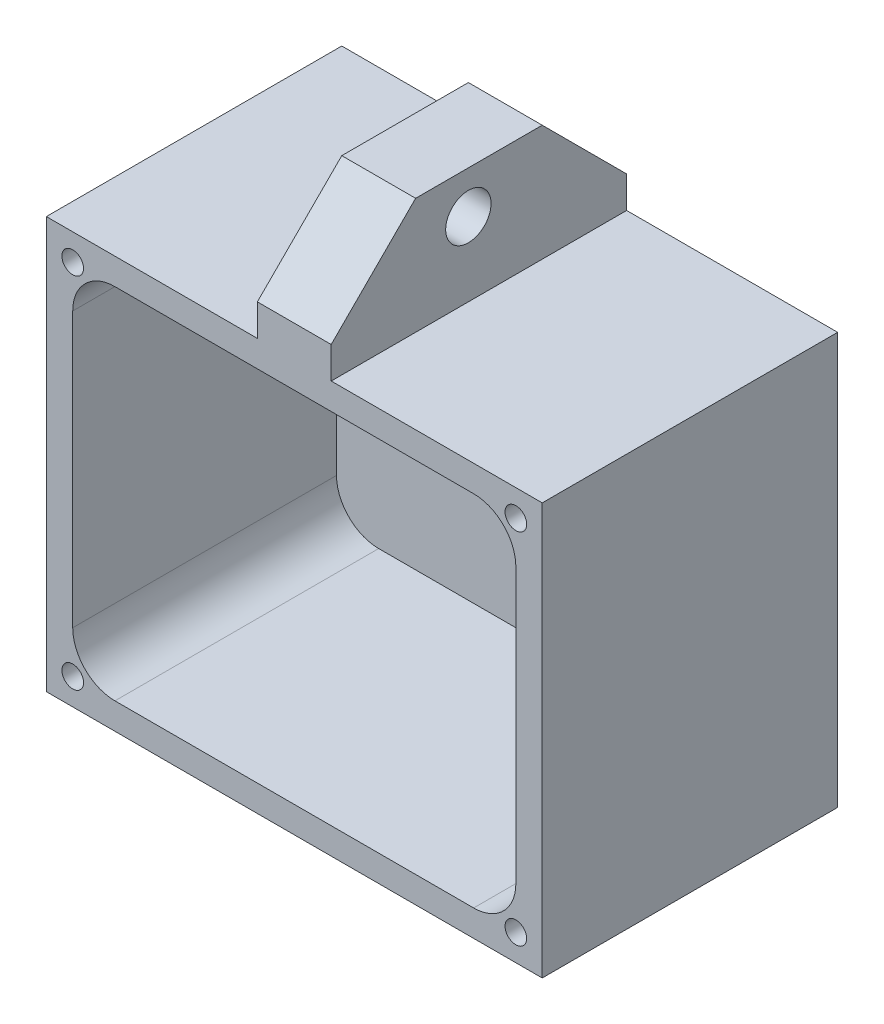
ISO-10303-21;
HEADER;
FILE_DESCRIPTION(('STEP AP214'),'2;1');
FILE_NAME('part.step','',(''),(''),'','','');
FILE_SCHEMA(('AUTOMOTIVE_DESIGN { 1 0 10303 214 1 1 1 1 }'));
ENDSEC;
DATA;
#1=APPLICATION_CONTEXT('core data for automotive mechanical design processes');
#2=APPLICATION_PROTOCOL_DEFINITION('international standard','automotive_design',2000,#1);
#3=PRODUCT_CONTEXT('',#1,'mechanical');
#4=PRODUCT('Part','Part','',(#3));
#5=PRODUCT_RELATED_PRODUCT_CATEGORY('part','',(#4));
#6=PRODUCT_DEFINITION_FORMATION('','',#4);
#7=PRODUCT_DEFINITION_CONTEXT('part definition',#1,'design');
#8=PRODUCT_DEFINITION('design','',#6,#7);
#9=PRODUCT_DEFINITION_SHAPE('','',#8);
#10=(LENGTH_UNIT() NAMED_UNIT(*) SI_UNIT(.MILLI.,.METRE.));
#11=(NAMED_UNIT(*) PLANE_ANGLE_UNIT() SI_UNIT($,.RADIAN.));
#12=(NAMED_UNIT(*) SI_UNIT($,.STERADIAN.) SOLID_ANGLE_UNIT());
#13=UNCERTAINTY_MEASURE_WITH_UNIT(LENGTH_MEASURE(1.E-05),#10,'distance_accuracy_value','');
#14=(GEOMETRIC_REPRESENTATION_CONTEXT(3) GLOBAL_UNCERTAINTY_ASSIGNED_CONTEXT((#13)) GLOBAL_UNIT_ASSIGNED_CONTEXT((#10,
#11,#12)) REPRESENTATION_CONTEXT('',''));
#15=CARTESIAN_POINT('',(0.,0.,0.));
#16=DIRECTION('',(0.,0.,1.));
#17=DIRECTION('',(1.,0.,0.));
#18=AXIS2_PLACEMENT_3D('',#15,#16,#17);
#19=CARTESIAN_POINT('',(-23.5,19.5,28.));
#20=DIRECTION('',(0.,-1.,0.));
#21=DIRECTION('',(0.,0.,-1.));
#22=AXIS2_PLACEMENT_3D('',#19,#20,#21);
#23=PLANE('',#22);
#24=DIRECTION('',(0.,0.,-1.));
#25=VECTOR('',#24,1.);
#26=CARTESIAN_POINT('',(3.5,19.5,41.0384048104053));
#27=LINE('',#26,#25);
#28=CARTESIAN_POINT('',(3.5,19.5,28.));
#29=VERTEX_POINT('',#28);
#30=CARTESIAN_POINT('',(3.5,19.5,0.));
#31=VERTEX_POINT('',#30);
#32=EDGE_CURVE('E253',#29,#31,#27,.T.);
#33=ORIENTED_EDGE('',*,*,#32,.F.);
#34=DIRECTION('',(-1.,0.,0.));
#35=VECTOR('',#34,1.);
#36=CARTESIAN_POINT('',(-23.5,19.5,28.));
#37=LINE('',#36,#35);
#38=CARTESIAN_POINT('',(23.5,19.5,28.));
#39=VERTEX_POINT('',#38);
#40=EDGE_CURVE('E397',#39,#29,#37,.T.);
#41=ORIENTED_EDGE('',*,*,#40,.F.);
#42=DIRECTION('',(0.,0.,-1.));
#43=VECTOR('',#42,1.);
#44=CARTESIAN_POINT('',(23.5,19.5,28.));
#45=LINE('',#44,#43);
#46=CARTESIAN_POINT('',(23.5,19.5,0.));
#47=VERTEX_POINT('',#46);
#48=EDGE_CURVE('E256',#39,#47,#45,.T.);
#49=ORIENTED_EDGE('',*,*,#48,.T.);
#50=DIRECTION('',(-1.,0.,0.));
#51=VECTOR('',#50,1.);
#52=CARTESIAN_POINT('',(-23.5,19.5,0.));
#53=LINE('',#52,#51);
#54=EDGE_CURVE('E242',#47,#31,#53,.T.);
#55=ORIENTED_EDGE('',*,*,#54,.T.);
#56=EDGE_LOOP('',(#33,#41,#49,#55));
#57=FACE_BOUND('',#56,.T.);
#58=ADVANCED_FACE('F59',(#57),#23,.F.);
#59=CARTESIAN_POINT('',(23.5,-19.5,28.));
#60=DIRECTION('',(-1.,0.,0.));
#61=DIRECTION('',(0.,0.,1.));
#62=AXIS2_PLACEMENT_3D('',#59,#60,#61);
#63=PLANE('',#62);
#64=DIRECTION('',(0.,1.,0.));
#65=VECTOR('',#64,1.);
#66=CARTESIAN_POINT('',(23.5,-19.5,0.));
#67=LINE('',#66,#65);
#68=CARTESIAN_POINT('',(23.5,-19.5,0.));
#69=VERTEX_POINT('',#68);
#70=EDGE_CURVE('E380',#69,#47,#67,.T.);
#71=ORIENTED_EDGE('',*,*,#70,.T.);
#72=ORIENTED_EDGE('',*,*,#48,.F.);
#73=DIRECTION('',(0.,1.,0.));
#74=VECTOR('',#73,1.);
#75=CARTESIAN_POINT('',(23.5,-19.5,28.));
#76=LINE('',#75,#74);
#77=CARTESIAN_POINT('',(23.5,-19.5,28.));
#78=VERTEX_POINT('',#77);
#79=EDGE_CURVE('E388',#78,#39,#76,.T.);
#80=ORIENTED_EDGE('',*,*,#79,.F.);
#81=DIRECTION('',(0.,0.,-1.));
#82=VECTOR('',#81,1.);
#83=CARTESIAN_POINT('',(23.5,-19.5,28.));
#84=LINE('',#83,#82);
#85=EDGE_CURVE('E410',#78,#69,#84,.T.);
#86=ORIENTED_EDGE('',*,*,#85,.T.);
#87=EDGE_LOOP('',(#71,#72,#80,#86));
#88=FACE_BOUND('',#87,.T.);
#89=ADVANCED_FACE('F531',(#88),#63,.F.);
#90=CARTESIAN_POINT('',(-3.5,19.5,28.));
#91=VERTEX_POINT('',#90);
#92=CARTESIAN_POINT('',(-23.5,19.5,28.));
#93=VERTEX_POINT('',#92);
#94=EDGE_CURVE('E279',#91,#93,#37,.T.);
#95=ORIENTED_EDGE('',*,*,#94,.F.);
#96=DIRECTION('',(0.,0.,-1.));
#97=VECTOR('',#96,1.);
#98=CARTESIAN_POINT('',(-3.5,19.5,41.0384048104053));
#99=LINE('',#98,#97);
#100=CARTESIAN_POINT('',(-3.5,19.5,0.));
#101=VERTEX_POINT('',#100);
#102=EDGE_CURVE('E267',#91,#101,#99,.T.);
#103=ORIENTED_EDGE('',*,*,#102,.T.);
#104=CARTESIAN_POINT('',(-23.5,19.5,0.));
#105=VERTEX_POINT('',#104);
#106=EDGE_CURVE('E260',#101,#105,#53,.T.);
#107=ORIENTED_EDGE('',*,*,#106,.T.);
#108=DIRECTION('',(0.,0.,-1.));
#109=VECTOR('',#108,1.);
#110=CARTESIAN_POINT('',(-23.5,19.5,28.));
#111=LINE('',#110,#109);
#112=EDGE_CURVE('E419',#93,#105,#111,.T.);
#113=ORIENTED_EDGE('',*,*,#112,.F.);
#114=EDGE_LOOP('',(#95,#103,#107,#113));
#115=FACE_BOUND('',#114,.T.);
#116=ADVANCED_FACE('F533',(#115),#23,.F.);
#117=CARTESIAN_POINT('',(-23.5,-19.5,28.));
#118=DIRECTION('',(1.,0.,0.));
#119=DIRECTION('',(0.,0.,-1.));
#120=AXIS2_PLACEMENT_3D('',#117,#118,#119);
#121=PLANE('',#120);
#122=DIRECTION('',(0.,-1.,0.));
#123=VECTOR('',#122,1.);
#124=CARTESIAN_POINT('',(-23.5,-19.5,0.));
#125=LINE('',#124,#123);
#126=CARTESIAN_POINT('',(-23.5,-19.5,0.));
#127=VERTEX_POINT('',#126);
#128=EDGE_CURVE('E259',#105,#127,#125,.T.);
#129=ORIENTED_EDGE('',*,*,#128,.T.);
#130=DIRECTION('',(0.,0.,-1.));
#131=VECTOR('',#130,1.);
#132=CARTESIAN_POINT('',(-23.5,-19.5,28.));
#133=LINE('',#132,#131);
#134=CARTESIAN_POINT('',(-23.5,-19.5,28.));
#135=VERTEX_POINT('',#134);
#136=EDGE_CURVE('E414',#135,#127,#133,.T.);
#137=ORIENTED_EDGE('',*,*,#136,.F.);
#138=DIRECTION('',(0.,-1.,0.));
#139=VECTOR('',#138,1.);
#140=CARTESIAN_POINT('',(-23.5,-19.5,28.));
#141=LINE('',#140,#139);
#142=EDGE_CURVE('E394',#93,#135,#141,.T.);
#143=ORIENTED_EDGE('',*,*,#142,.F.);
#144=ORIENTED_EDGE('',*,*,#112,.T.);
#145=EDGE_LOOP('',(#129,#137,#143,#144));
#146=FACE_BOUND('',#145,.T.);
#147=ADVANCED_FACE('F541',(#146),#121,.F.);
#148=CARTESIAN_POINT('',(-23.5,-19.5,28.));
#149=DIRECTION('',(0.,1.,0.));
#150=DIRECTION('',(0.,0.,1.));
#151=AXIS2_PLACEMENT_3D('',#148,#149,#150);
#152=PLANE('',#151);
#153=DIRECTION('',(1.,0.,0.));
#154=VECTOR('',#153,1.);
#155=CARTESIAN_POINT('',(-23.5,-19.5,0.));
#156=LINE('',#155,#154);
#157=EDGE_CURVE('E391',#127,#69,#156,.T.);
#158=ORIENTED_EDGE('',*,*,#157,.T.);
#159=ORIENTED_EDGE('',*,*,#85,.F.);
#160=DIRECTION('',(1.,0.,0.));
#161=VECTOR('',#160,1.);
#162=CARTESIAN_POINT('',(-23.5,-19.5,28.));
#163=LINE('',#162,#161);
#164=EDGE_CURVE('E415',#135,#78,#163,.T.);
#165=ORIENTED_EDGE('',*,*,#164,.F.);
#166=ORIENTED_EDGE('',*,*,#136,.T.);
#167=EDGE_LOOP('',(#158,#159,#165,#166));
#168=FACE_BOUND('',#167,.T.);
#169=ADVANCED_FACE('F546',(#168),#152,.F.);
#170=CARTESIAN_POINT('',(0.,0.,28.));
#171=DIRECTION('',(0.,0.,-1.));
#172=DIRECTION('',(-1.,0.,0.));
#173=AXIS2_PLACEMENT_3D('',#170,#171,#172);
#174=PLANE('',#173);
#175=CARTESIAN_POINT('',(21.,17.,28.));
#176=DIRECTION('',(0.,0.,1.));
#177=DIRECTION('',(1.,0.,0.));
#178=AXIS2_PLACEMENT_3D('',#175,#176,#177);
#179=CIRCLE('',#178,1.02499999999999);
#180=CARTESIAN_POINT('',(22.025,17.,28.));
#181=VERTEX_POINT('',#180);
#182=EDGE_CURVE('E323',#181,#181,#179,.T.);
#183=ORIENTED_EDGE('',*,*,#182,.F.);
#184=EDGE_LOOP('',(#183));
#185=FACE_BOUND('',#184,.T.);
#186=CARTESIAN_POINT('',(-21.,-17.,28.));
#187=DIRECTION('',(0.,0.,1.));
#188=DIRECTION('',(1.,0.,0.));
#189=AXIS2_PLACEMENT_3D('',#186,#187,#188);
#190=CIRCLE('',#189,1.02499999999999);
#191=CARTESIAN_POINT('',(-19.975,-17.,28.));
#192=VERTEX_POINT('',#191);
#193=EDGE_CURVE('E331',#192,#192,#190,.T.);
#194=ORIENTED_EDGE('',*,*,#193,.F.);
#195=EDGE_LOOP('',(#194));
#196=FACE_BOUND('',#195,.T.);
#197=CARTESIAN_POINT('',(-21.,17.,28.));
#198=DIRECTION('',(0.,0.,1.));
#199=DIRECTION('',(1.,0.,0.));
#200=AXIS2_PLACEMENT_3D('',#197,#198,#199);
#201=CIRCLE('',#200,1.02499999999999);
#202=CARTESIAN_POINT('',(-19.975,17.,28.));
#203=VERTEX_POINT('',#202);
#204=EDGE_CURVE('E339',#203,#203,#201,.T.);
#205=ORIENTED_EDGE('',*,*,#204,.F.);
#206=EDGE_LOOP('',(#205));
#207=FACE_BOUND('',#206,.T.);
#208=CARTESIAN_POINT('',(21.,-17.,28.));
#209=DIRECTION('',(0.,0.,1.));
#210=DIRECTION('',(1.,0.,0.));
#211=AXIS2_PLACEMENT_3D('',#208,#209,#210);
#212=CIRCLE('',#211,1.02499999999999);
#213=CARTESIAN_POINT('',(22.025,-17.,28.));
#214=VERTEX_POINT('',#213);
#215=EDGE_CURVE('E347',#214,#214,#212,.T.);
#216=ORIENTED_EDGE('',*,*,#215,.F.);
#217=EDGE_LOOP('',(#216));
#218=FACE_BOUND('',#217,.T.);
#219=DIRECTION('',(0.,-1.,0.));
#220=VECTOR('',#219,1.);
#221=CARTESIAN_POINT('',(-21.,17.,28.));
#222=LINE('',#221,#220);
#223=CARTESIAN_POINT('',(-21.,13.,28.));
#224=VERTEX_POINT('',#223);
#225=CARTESIAN_POINT('',(-21.,-13.,28.));
#226=VERTEX_POINT('',#225);
#227=EDGE_CURVE('E361',#224,#226,#222,.T.);
#228=ORIENTED_EDGE('',*,*,#227,.F.);
#229=CARTESIAN_POINT('',(-17.,13.,28.));
#230=DIRECTION('',(0.,0.,-1.));
#231=DIRECTION('',(-1.,0.,0.));
#232=AXIS2_PLACEMENT_3D('',#229,#230,#231);
#233=CIRCLE('',#232,4.);
#234=CARTESIAN_POINT('',(-17.,17.,28.));
#235=VERTEX_POINT('',#234);
#236=EDGE_CURVE('E471',#224,#235,#233,.T.);
#237=ORIENTED_EDGE('',*,*,#236,.T.);
#238=DIRECTION('',(-1.,0.,0.));
#239=VECTOR('',#238,1.);
#240=CARTESIAN_POINT('',(-21.,17.,28.));
#241=LINE('',#240,#239);
#242=CARTESIAN_POINT('',(17.,17.,28.));
#243=VERTEX_POINT('',#242);
#244=EDGE_CURVE('E365',#243,#235,#241,.T.);
#245=ORIENTED_EDGE('',*,*,#244,.F.);
#246=CARTESIAN_POINT('',(17.,13.,28.));
#247=DIRECTION('',(0.,0.,-1.));
#248=DIRECTION('',(-1.,0.,0.));
#249=AXIS2_PLACEMENT_3D('',#246,#247,#248);
#250=CIRCLE('',#249,4.);
#251=CARTESIAN_POINT('',(21.,13.,28.));
#252=VERTEX_POINT('',#251);
#253=EDGE_CURVE('E473',#243,#252,#250,.T.);
#254=ORIENTED_EDGE('',*,*,#253,.T.);
#255=DIRECTION('',(0.,1.,0.));
#256=VECTOR('',#255,1.);
#257=CARTESIAN_POINT('',(21.,17.,28.));
#258=LINE('',#257,#256);
#259=CARTESIAN_POINT('',(21.,-13.,28.));
#260=VERTEX_POINT('',#259);
#261=EDGE_CURVE('E355',#260,#252,#258,.T.);
#262=ORIENTED_EDGE('',*,*,#261,.F.);
#263=CARTESIAN_POINT('',(17.,-13.,28.));
#264=DIRECTION('',(0.,0.,-1.));
#265=DIRECTION('',(-1.,0.,0.));
#266=AXIS2_PLACEMENT_3D('',#263,#264,#265);
#267=CIRCLE('',#266,4.);
#268=CARTESIAN_POINT('',(17.,-17.,28.));
#269=VERTEX_POINT('',#268);
#270=EDGE_CURVE('E465',#260,#269,#267,.T.);
#271=ORIENTED_EDGE('',*,*,#270,.T.);
#272=DIRECTION('',(1.,0.,0.));
#273=VECTOR('',#272,1.);
#274=CARTESIAN_POINT('',(-21.,-17.,28.));
#275=LINE('',#274,#273);
#276=CARTESIAN_POINT('',(-17.,-17.,28.));
#277=VERTEX_POINT('',#276);
#278=EDGE_CURVE('E356',#277,#269,#275,.T.);
#279=ORIENTED_EDGE('',*,*,#278,.F.);
#280=CARTESIAN_POINT('',(-17.,-13.,28.));
#281=DIRECTION('',(0.,0.,-1.));
#282=DIRECTION('',(-1.,0.,0.));
#283=AXIS2_PLACEMENT_3D('',#280,#281,#282);
#284=CIRCLE('',#283,4.);
#285=EDGE_CURVE('E468',#277,#226,#284,.T.);
#286=ORIENTED_EDGE('',*,*,#285,.T.);
#287=EDGE_LOOP('',(#228,#237,#245,#254,#262,#271,#279,#286));
#288=FACE_BOUND('',#287,.T.);
#289=DIRECTION('',(0.,1.,0.));
#290=VECTOR('',#289,1.);
#291=CARTESIAN_POINT('',(3.5,30.5,28.));
#292=LINE('',#291,#290);
#293=CARTESIAN_POINT('',(3.5,22.5,28.));
#294=VERTEX_POINT('',#293);
#295=EDGE_CURVE('E265',#29,#294,#292,.T.);
#296=ORIENTED_EDGE('',*,*,#295,.T.);
#297=DIRECTION('',(-1.,0.,0.));
#298=VECTOR('',#297,1.);
#299=CARTESIAN_POINT('',(-3.5,22.5,28.));
#300=LINE('',#299,#298);
#301=CARTESIAN_POINT('',(-3.5,22.5,28.));
#302=VERTEX_POINT('',#301);
#303=EDGE_CURVE('E14',#294,#302,#300,.T.);
#304=ORIENTED_EDGE('',*,*,#303,.T.);
#305=DIRECTION('',(0.,-1.,0.));
#306=VECTOR('',#305,1.);
#307=CARTESIAN_POINT('',(-3.5,30.5,28.));
#308=LINE('',#307,#306);
#309=EDGE_CURVE('E299',#302,#91,#308,.T.);
#310=ORIENTED_EDGE('',*,*,#309,.T.);
#311=ORIENTED_EDGE('',*,*,#94,.T.);
#312=ORIENTED_EDGE('',*,*,#142,.T.);
#313=ORIENTED_EDGE('',*,*,#164,.T.);
#314=ORIENTED_EDGE('',*,*,#79,.T.);
#315=ORIENTED_EDGE('',*,*,#40,.T.);
#316=EDGE_LOOP('',(#296,#304,#310,#311,#312,#313,#314,#315));
#317=FACE_BOUND('',#316,.T.);
#318=ADVANCED_FACE('F563',(#185,#196,#207,#218,#288,#317),#174,.F.);
#319=CARTESIAN_POINT('',(0.,0.,0.));
#320=DIRECTION('',(0.,0.,-1.));
#321=DIRECTION('',(-1.,0.,0.));
#322=AXIS2_PLACEMENT_3D('',#319,#320,#321);
#323=PLANE('',#322);
#324=CARTESIAN_POINT('',(0.,0.,0.));
#325=DIRECTION('',(0.,0.,-1.));
#326=DIRECTION('',(-1.,0.,0.));
#327=AXIS2_PLACEMENT_3D('',#324,#325,#326);
#328=CIRCLE('',#327,6.);
#329=CARTESIAN_POINT('',(-6.,0.,0.));
#330=VERTEX_POINT('',#329);
#331=EDGE_CURVE('E295',#330,#330,#328,.F.);
#332=ORIENTED_EDGE('',*,*,#331,.T.);
#333=EDGE_LOOP('',(#332));
#334=FACE_BOUND('',#333,.T.);
#335=CARTESIAN_POINT('',(12.,-6.5,0.));
#336=DIRECTION('',(0.,0.,-1.));
#337=DIRECTION('',(-1.,0.,0.));
#338=AXIS2_PLACEMENT_3D('',#335,#336,#337);
#339=CIRCLE('',#338,1.24999999999999);
#340=CARTESIAN_POINT('',(10.75,-6.5,0.));
#341=VERTEX_POINT('',#340);
#342=EDGE_CURVE('E294',#341,#341,#339,.T.);
#343=ORIENTED_EDGE('',*,*,#342,.F.);
#344=EDGE_LOOP('',(#343));
#345=FACE_BOUND('',#344,.T.);
#346=CARTESIAN_POINT('',(-12.,-6.5,0.));
#347=DIRECTION('',(0.,0.,-1.));
#348=DIRECTION('',(-1.,0.,0.));
#349=AXIS2_PLACEMENT_3D('',#346,#347,#348);
#350=CIRCLE('',#349,1.24999999999999);
#351=CARTESIAN_POINT('',(-13.25,-6.5,0.));
#352=VERTEX_POINT('',#351);
#353=EDGE_CURVE('E307',#352,#352,#350,.T.);
#354=ORIENTED_EDGE('',*,*,#353,.F.);
#355=EDGE_LOOP('',(#354));
#356=FACE_BOUND('',#355,.T.);
#357=CARTESIAN_POINT('',(0.,10.5,0.));
#358=DIRECTION('',(0.,0.,-1.));
#359=DIRECTION('',(-1.,0.,0.));
#360=AXIS2_PLACEMENT_3D('',#357,#358,#359);
#361=CIRCLE('',#360,1.24999999999999);
#362=CARTESIAN_POINT('',(-1.24999999999999,10.5,0.));
#363=VERTEX_POINT('',#362);
#364=EDGE_CURVE('E315',#363,#363,#361,.T.);
#365=ORIENTED_EDGE('',*,*,#364,.F.);
#366=EDGE_LOOP('',(#365));
#367=FACE_BOUND('',#366,.T.);
#368=DIRECTION('',(0.,1.,0.));
#369=VECTOR('',#368,1.);
#370=CARTESIAN_POINT('',(-3.5,30.5,0.));
#371=LINE('',#370,#369);
#372=CARTESIAN_POINT('',(-3.5,22.5,0.));
#373=VERTEX_POINT('',#372);
#374=EDGE_CURVE('E250',#101,#373,#371,.T.);
#375=ORIENTED_EDGE('',*,*,#374,.T.);
#376=DIRECTION('',(1.,0.,0.));
#377=VECTOR('',#376,1.);
#378=CARTESIAN_POINT('',(0.,22.5,0.));
#379=LINE('',#378,#377);
#380=CARTESIAN_POINT('',(3.5,22.5,0.));
#381=VERTEX_POINT('',#380);
#382=EDGE_CURVE('E245',#373,#381,#379,.T.);
#383=ORIENTED_EDGE('',*,*,#382,.T.);
#384=DIRECTION('',(0.,-1.,0.));
#385=VECTOR('',#384,1.);
#386=CARTESIAN_POINT('',(3.5,30.5,0.));
#387=LINE('',#386,#385);
#388=EDGE_CURVE('E237',#381,#31,#387,.T.);
#389=ORIENTED_EDGE('',*,*,#388,.T.);
#390=ORIENTED_EDGE('',*,*,#54,.F.);
#391=ORIENTED_EDGE('',*,*,#70,.F.);
#392=ORIENTED_EDGE('',*,*,#157,.F.);
#393=ORIENTED_EDGE('',*,*,#128,.F.);
#394=ORIENTED_EDGE('',*,*,#106,.F.);
#395=EDGE_LOOP('',(#375,#383,#389,#390,#391,#392,#393,#394));
#396=FACE_BOUND('',#395,.T.);
#397=ADVANCED_FACE('F240',(#334,#345,#356,#367,#396),#323,.T.);
#398=CARTESIAN_POINT('',(0.,0.,3.));
#399=DIRECTION('',(0.,0.,-1.));
#400=DIRECTION('',(-1.,0.,0.));
#401=AXIS2_PLACEMENT_3D('',#398,#399,#400);
#402=PLANE('',#401);
#403=CARTESIAN_POINT('',(0.,0.,3.));
#404=DIRECTION('',(0.,0.,1.));
#405=DIRECTION('',(1.,0.,0.));
#406=AXIS2_PLACEMENT_3D('',#403,#404,#405);
#407=CIRCLE('',#406,6.);
#408=CARTESIAN_POINT('',(6.,0.,3.));
#409=VERTEX_POINT('',#408);
#410=EDGE_CURVE('E290',#409,#409,#407,.T.);
#411=ORIENTED_EDGE('',*,*,#410,.F.);
#412=EDGE_LOOP('',(#411));
#413=FACE_BOUND('',#412,.T.);
#414=CARTESIAN_POINT('',(12.,-6.5,3.));
#415=DIRECTION('',(0.,0.,-1.));
#416=DIRECTION('',(-1.,0.,0.));
#417=AXIS2_PLACEMENT_3D('',#414,#415,#416);
#418=CIRCLE('',#417,1.24999999999999);
#419=CARTESIAN_POINT('',(10.75,-6.5,3.));
#420=VERTEX_POINT('',#419);
#421=EDGE_CURVE('E303',#420,#420,#418,.T.);
#422=ORIENTED_EDGE('',*,*,#421,.T.);
#423=EDGE_LOOP('',(#422));
#424=FACE_BOUND('',#423,.T.);
#425=CARTESIAN_POINT('',(-12.,-6.5,3.));
#426=DIRECTION('',(0.,0.,-1.));
#427=DIRECTION('',(-1.,0.,0.));
#428=AXIS2_PLACEMENT_3D('',#425,#426,#427);
#429=CIRCLE('',#428,1.24999999999999);
#430=CARTESIAN_POINT('',(-13.25,-6.5,3.));
#431=VERTEX_POINT('',#430);
#432=EDGE_CURVE('E311',#431,#431,#429,.T.);
#433=ORIENTED_EDGE('',*,*,#432,.T.);
#434=EDGE_LOOP('',(#433));
#435=FACE_BOUND('',#434,.T.);
#436=CARTESIAN_POINT('',(0.,10.5,3.));
#437=DIRECTION('',(0.,0.,-1.));
#438=DIRECTION('',(-1.,0.,0.));
#439=AXIS2_PLACEMENT_3D('',#436,#437,#438);
#440=CIRCLE('',#439,1.24999999999999);
#441=CARTESIAN_POINT('',(-1.24999999999999,10.5,3.));
#442=VERTEX_POINT('',#441);
#443=EDGE_CURVE('E319',#442,#442,#440,.T.);
#444=ORIENTED_EDGE('',*,*,#443,.T.);
#445=EDGE_LOOP('',(#444));
#446=FACE_BOUND('',#445,.T.);
#447=DIRECTION('',(1.,0.,0.));
#448=VECTOR('',#447,1.);
#449=CARTESIAN_POINT('',(-21.,-17.,3.));
#450=LINE('',#449,#448);
#451=CARTESIAN_POINT('',(-17.,-17.,3.));
#452=VERTEX_POINT('',#451);
#453=CARTESIAN_POINT('',(17.,-17.,3.));
#454=VERTEX_POINT('',#453);
#455=EDGE_CURVE('E381',#452,#454,#450,.T.);
#456=ORIENTED_EDGE('',*,*,#455,.T.);
#457=CARTESIAN_POINT('',(17.,-13.,3.));
#458=DIRECTION('',(0.,0.,-1.));
#459=DIRECTION('',(-1.,0.,0.));
#460=AXIS2_PLACEMENT_3D('',#457,#458,#459);
#461=CIRCLE('',#460,4.);
#462=CARTESIAN_POINT('',(21.,-13.,3.));
#463=VERTEX_POINT('',#462);
#464=EDGE_CURVE('E448',#454,#463,#461,.F.);
#465=ORIENTED_EDGE('',*,*,#464,.T.);
#466=DIRECTION('',(0.,1.,0.));
#467=VECTOR('',#466,1.);
#468=CARTESIAN_POINT('',(21.,17.,3.));
#469=LINE('',#468,#467);
#470=CARTESIAN_POINT('',(21.,13.,3.));
#471=VERTEX_POINT('',#470);
#472=EDGE_CURVE('E376',#463,#471,#469,.T.);
#473=ORIENTED_EDGE('',*,*,#472,.T.);
#474=CARTESIAN_POINT('',(17.,13.,3.));
#475=DIRECTION('',(0.,0.,-1.));
#476=DIRECTION('',(-1.,0.,0.));
#477=AXIS2_PLACEMENT_3D('',#474,#475,#476);
#478=CIRCLE('',#477,4.);
#479=CARTESIAN_POINT('',(17.,17.,3.));
#480=VERTEX_POINT('',#479);
#481=EDGE_CURVE('E439',#471,#480,#478,.F.);
#482=ORIENTED_EDGE('',*,*,#481,.T.);
#483=DIRECTION('',(-1.,0.,0.));
#484=VECTOR('',#483,1.);
#485=CARTESIAN_POINT('',(-21.,17.,3.));
#486=LINE('',#485,#484);
#487=CARTESIAN_POINT('',(-17.,17.,3.));
#488=VERTEX_POINT('',#487);
#489=EDGE_CURVE('E360',#480,#488,#486,.T.);
#490=ORIENTED_EDGE('',*,*,#489,.T.);
#491=CARTESIAN_POINT('',(-17.,13.,3.));
#492=DIRECTION('',(0.,0.,-1.));
#493=DIRECTION('',(-1.,0.,0.));
#494=AXIS2_PLACEMENT_3D('',#491,#492,#493);
#495=CIRCLE('',#494,4.);
#496=CARTESIAN_POINT('',(-21.,13.,3.));
#497=VERTEX_POINT('',#496);
#498=EDGE_CURVE('E442',#488,#497,#495,.F.);
#499=ORIENTED_EDGE('',*,*,#498,.T.);
#500=DIRECTION('',(0.,-1.,0.));
#501=VECTOR('',#500,1.);
#502=CARTESIAN_POINT('',(-21.,17.,3.));
#503=LINE('',#502,#501);
#504=CARTESIAN_POINT('',(-21.,-13.,3.));
#505=VERTEX_POINT('',#504);
#506=EDGE_CURVE('E375',#497,#505,#503,.T.);
#507=ORIENTED_EDGE('',*,*,#506,.T.);
#508=CARTESIAN_POINT('',(-17.,-13.,3.));
#509=DIRECTION('',(0.,0.,-1.));
#510=DIRECTION('',(-1.,0.,0.));
#511=AXIS2_PLACEMENT_3D('',#508,#509,#510);
#512=CIRCLE('',#511,4.);
#513=EDGE_CURVE('E445',#505,#452,#512,.F.);
#514=ORIENTED_EDGE('',*,*,#513,.T.);
#515=EDGE_LOOP('',(#456,#465,#473,#482,#490,#499,#507,#514));
#516=FACE_BOUND('',#515,.T.);
#517=ADVANCED_FACE('F583',(#413,#424,#435,#446,#516),#402,.F.);
#518=CARTESIAN_POINT('',(-21.,17.,-54.0370243444252));
#519=DIRECTION('',(0.,1.,0.));
#520=DIRECTION('',(0.,0.,1.));
#521=AXIS2_PLACEMENT_3D('',#518,#519,#520);
#522=PLANE('',#521);
#523=ORIENTED_EDGE('',*,*,#244,.T.);
#524=DIRECTION('',(0.,0.,1.));
#525=VECTOR('',#524,1.);
#526=CARTESIAN_POINT('',(-17.,17.,3.));
#527=LINE('',#526,#525);
#528=EDGE_CURVE('E462',#235,#488,#527,.F.);
#529=ORIENTED_EDGE('',*,*,#528,.T.);
#530=ORIENTED_EDGE('',*,*,#489,.F.);
#531=DIRECTION('',(0.,0.,1.));
#532=VECTOR('',#531,1.);
#533=CARTESIAN_POINT('',(17.,17.,28.));
#534=LINE('',#533,#532);
#535=EDGE_CURVE('E458',#480,#243,#534,.T.);
#536=ORIENTED_EDGE('',*,*,#535,.T.);
#537=EDGE_LOOP('',(#523,#529,#530,#536));
#538=FACE_BOUND('',#537,.T.);
#539=ADVANCED_FACE('F588',(#538),#522,.F.);
#540=CARTESIAN_POINT('',(-21.,17.,-54.0370243444252));
#541=DIRECTION('',(-1.,0.,0.));
#542=DIRECTION('',(0.,-1.,0.));
#543=AXIS2_PLACEMENT_3D('',#540,#541,#542);
#544=PLANE('',#543);
#545=ORIENTED_EDGE('',*,*,#227,.T.);
#546=DIRECTION('',(0.,0.,1.));
#547=VECTOR('',#546,1.);
#548=CARTESIAN_POINT('',(-21.,-13.,3.));
#549=LINE('',#548,#547);
#550=EDGE_CURVE('E455',#226,#505,#549,.F.);
#551=ORIENTED_EDGE('',*,*,#550,.T.);
#552=ORIENTED_EDGE('',*,*,#506,.F.);
#553=DIRECTION('',(0.,0.,1.));
#554=VECTOR('',#553,1.);
#555=CARTESIAN_POINT('',(-21.,13.,28.));
#556=LINE('',#555,#554);
#557=EDGE_CURVE('E451',#497,#224,#556,.T.);
#558=ORIENTED_EDGE('',*,*,#557,.T.);
#559=EDGE_LOOP('',(#545,#551,#552,#558));
#560=FACE_BOUND('',#559,.T.);
#561=ADVANCED_FACE('F592',(#560),#544,.F.);
#562=CARTESIAN_POINT('',(-21.,-17.,-54.0370243444252));
#563=DIRECTION('',(0.,-1.,0.));
#564=DIRECTION('',(0.,0.,-1.));
#565=AXIS2_PLACEMENT_3D('',#562,#563,#564);
#566=PLANE('',#565);
#567=ORIENTED_EDGE('',*,*,#278,.T.);
#568=DIRECTION('',(0.,0.,1.));
#569=VECTOR('',#568,1.);
#570=CARTESIAN_POINT('',(17.,-17.,3.));
#571=LINE('',#570,#569);
#572=EDGE_CURVE('E436',#269,#454,#571,.F.);
#573=ORIENTED_EDGE('',*,*,#572,.T.);
#574=ORIENTED_EDGE('',*,*,#455,.F.);
#575=DIRECTION('',(0.,0.,1.));
#576=VECTOR('',#575,1.);
#577=CARTESIAN_POINT('',(-17.,-17.,28.));
#578=LINE('',#577,#576);
#579=EDGE_CURVE('E432',#452,#277,#578,.T.);
#580=ORIENTED_EDGE('',*,*,#579,.T.);
#581=EDGE_LOOP('',(#567,#573,#574,#580));
#582=FACE_BOUND('',#581,.T.);
#583=ADVANCED_FACE('F596',(#582),#566,.F.);
#584=CARTESIAN_POINT('',(21.,17.,-54.0370243444252));
#585=DIRECTION('',(1.,0.,0.));
#586=DIRECTION('',(0.,0.,-1.));
#587=AXIS2_PLACEMENT_3D('',#584,#585,#586);
#588=PLANE('',#587);
#589=ORIENTED_EDGE('',*,*,#472,.F.);
#590=DIRECTION('',(0.,0.,1.));
#591=VECTOR('',#590,1.);
#592=CARTESIAN_POINT('',(21.,-13.,28.));
#593=LINE('',#592,#591);
#594=EDGE_CURVE('E428',#463,#260,#593,.T.);
#595=ORIENTED_EDGE('',*,*,#594,.T.);
#596=ORIENTED_EDGE('',*,*,#261,.T.);
#597=DIRECTION('',(0.,0.,1.));
#598=VECTOR('',#597,1.);
#599=CARTESIAN_POINT('',(21.,13.,3.));
#600=LINE('',#599,#598);
#601=EDGE_CURVE('E425',#252,#471,#600,.F.);
#602=ORIENTED_EDGE('',*,*,#601,.T.);
#603=EDGE_LOOP('',(#589,#595,#596,#602));
#604=FACE_BOUND('',#603,.T.);
#605=ADVANCED_FACE('F600',(#604),#588,.F.);
#606=CARTESIAN_POINT('',(17.,-13.,-54.0370243444252));
#607=DIRECTION('',(0.,0.,-1.));
#608=DIRECTION('',(-1.,0.,0.));
#609=AXIS2_PLACEMENT_3D('',#606,#607,#608);
#610=CYLINDRICAL_SURFACE('',#609,4.);
#611=ORIENTED_EDGE('',*,*,#464,.F.);
#612=ORIENTED_EDGE('',*,*,#572,.F.);
#613=ORIENTED_EDGE('',*,*,#270,.F.);
#614=ORIENTED_EDGE('',*,*,#594,.F.);
#615=EDGE_LOOP('',(#611,#612,#613,#614));
#616=FACE_BOUND('',#615,.T.);
#617=ADVANCED_FACE('F604',(#616),#610,.F.);
#618=CARTESIAN_POINT('',(-17.,-13.,-54.0370243444252));
#619=DIRECTION('',(0.,0.,-1.));
#620=DIRECTION('',(-1.,0.,0.));
#621=AXIS2_PLACEMENT_3D('',#618,#619,#620);
#622=CYLINDRICAL_SURFACE('',#621,4.);
#623=ORIENTED_EDGE('',*,*,#513,.F.);
#624=ORIENTED_EDGE('',*,*,#550,.F.);
#625=ORIENTED_EDGE('',*,*,#285,.F.);
#626=ORIENTED_EDGE('',*,*,#579,.F.);
#627=EDGE_LOOP('',(#623,#624,#625,#626));
#628=FACE_BOUND('',#627,.T.);
#629=ADVANCED_FACE('F677',(#628),#622,.F.);
#630=CARTESIAN_POINT('',(-17.,13.,-54.0370243444252));
#631=DIRECTION('',(0.,0.,-1.));
#632=DIRECTION('',(-1.,0.,0.));
#633=AXIS2_PLACEMENT_3D('',#630,#631,#632);
#634=CYLINDRICAL_SURFACE('',#633,4.);
#635=ORIENTED_EDGE('',*,*,#498,.F.);
#636=ORIENTED_EDGE('',*,*,#528,.F.);
#637=ORIENTED_EDGE('',*,*,#236,.F.);
#638=ORIENTED_EDGE('',*,*,#557,.F.);
#639=EDGE_LOOP('',(#635,#636,#637,#638));
#640=FACE_BOUND('',#639,.T.);
#641=ADVANCED_FACE('F683',(#640),#634,.F.);
#642=CARTESIAN_POINT('',(17.,13.,-54.0370243444252));
#643=DIRECTION('',(0.,0.,-1.));
#644=DIRECTION('',(-1.,0.,0.));
#645=AXIS2_PLACEMENT_3D('',#642,#643,#644);
#646=CYLINDRICAL_SURFACE('',#645,4.);
#647=ORIENTED_EDGE('',*,*,#481,.F.);
#648=ORIENTED_EDGE('',*,*,#601,.F.);
#649=ORIENTED_EDGE('',*,*,#253,.F.);
#650=ORIENTED_EDGE('',*,*,#535,.F.);
#651=EDGE_LOOP('',(#647,#648,#649,#650));
#652=FACE_BOUND('',#651,.T.);
#653=ADVANCED_FACE('F610',(#652),#646,.F.);
#654=CARTESIAN_POINT('',(21.,-17.,21.65));
#655=DIRECTION('',(0.,0.,1.));
#656=DIRECTION('',(1.,0.,0.));
#657=AXIS2_PLACEMENT_3D('',#654,#655,#656);
#658=CONICAL_SURFACE('',#657,1.02499999999999,1.02974425867665);
#659=CARTESIAN_POINT('',(21.,-17.,21.0341178654968));
#660=VERTEX_POINT('',#659);
#661=VERTEX_LOOP('',#660);
#662=FACE_BOUND('',#661,.T.);
#663=CARTESIAN_POINT('',(21.,-17.,21.65));
#664=DIRECTION('',(0.,0.,1.));
#665=DIRECTION('',(1.,0.,0.));
#666=AXIS2_PLACEMENT_3D('',#663,#664,#665);
#667=CIRCLE('',#666,1.02499999999999);
#668=CARTESIAN_POINT('',(22.025,-17.,21.65));
#669=VERTEX_POINT('',#668);
#670=EDGE_CURVE('E351',#669,#669,#667,.T.);
#671=ORIENTED_EDGE('',*,*,#670,.T.);
#672=EDGE_LOOP('',(#671));
#673=FACE_BOUND('',#672,.T.);
#674=ADVANCED_FACE('F606',(#662,#673),#658,.F.);
#675=CARTESIAN_POINT('',(21.,-17.,28.));
#676=DIRECTION('',(0.,0.,1.));
#677=DIRECTION('',(1.,0.,0.));
#678=AXIS2_PLACEMENT_3D('',#675,#676,#677);
#679=CYLINDRICAL_SURFACE('',#678,1.02499999999999);
#680=ORIENTED_EDGE('',*,*,#670,.F.);
#681=EDGE_LOOP('',(#680));
#682=FACE_BOUND('',#681,.T.);
#683=ORIENTED_EDGE('',*,*,#215,.T.);
#684=EDGE_LOOP('',(#683));
#685=FACE_BOUND('',#684,.T.);
#686=ADVANCED_FACE('F609',(#682,#685),#679,.F.);
#687=CARTESIAN_POINT('',(-21.,17.,21.65));
#688=DIRECTION('',(0.,0.,1.));
#689=DIRECTION('',(1.,0.,0.));
#690=AXIS2_PLACEMENT_3D('',#687,#688,#689);
#691=CONICAL_SURFACE('',#690,1.02499999999999,1.02974425867665);
#692=CARTESIAN_POINT('',(-21.,17.,21.0341178654968));
#693=VERTEX_POINT('',#692);
#694=VERTEX_LOOP('',#693);
#695=FACE_BOUND('',#694,.T.);
#696=CARTESIAN_POINT('',(-21.,17.,21.65));
#697=DIRECTION('',(0.,0.,1.));
#698=DIRECTION('',(1.,0.,0.));
#699=AXIS2_PLACEMENT_3D('',#696,#697,#698);
#700=CIRCLE('',#699,1.02499999999999);
#701=CARTESIAN_POINT('',(-19.975,17.,21.65));
#702=VERTEX_POINT('',#701);
#703=EDGE_CURVE('E343',#702,#702,#700,.T.);
#704=ORIENTED_EDGE('',*,*,#703,.T.);
#705=EDGE_LOOP('',(#704));
#706=FACE_BOUND('',#705,.T.);
#707=ADVANCED_FACE('F614',(#695,#706),#691,.F.);
#708=CARTESIAN_POINT('',(-21.,17.,28.));
#709=DIRECTION('',(0.,0.,1.));
#710=DIRECTION('',(1.,0.,0.));
#711=AXIS2_PLACEMENT_3D('',#708,#709,#710);
#712=CYLINDRICAL_SURFACE('',#711,1.02499999999999);
#713=ORIENTED_EDGE('',*,*,#703,.F.);
#714=EDGE_LOOP('',(#713));
#715=FACE_BOUND('',#714,.T.);
#716=ORIENTED_EDGE('',*,*,#204,.T.);
#717=EDGE_LOOP('',(#716));
#718=FACE_BOUND('',#717,.T.);
#719=ADVANCED_FACE('F618',(#715,#718),#712,.F.);
#720=CARTESIAN_POINT('',(-21.,-17.,21.65));
#721=DIRECTION('',(0.,0.,1.));
#722=DIRECTION('',(1.,0.,0.));
#723=AXIS2_PLACEMENT_3D('',#720,#721,#722);
#724=CONICAL_SURFACE('',#723,1.02499999999999,1.02974425867665);
#725=CARTESIAN_POINT('',(-21.,-17.,21.0341178654968));
#726=VERTEX_POINT('',#725);
#727=VERTEX_LOOP('',#726);
#728=FACE_BOUND('',#727,.T.);
#729=CARTESIAN_POINT('',(-21.,-17.,21.65));
#730=DIRECTION('',(0.,0.,1.));
#731=DIRECTION('',(1.,0.,0.));
#732=AXIS2_PLACEMENT_3D('',#729,#730,#731);
#733=CIRCLE('',#732,1.02499999999999);
#734=CARTESIAN_POINT('',(-19.975,-17.,21.65));
#735=VERTEX_POINT('',#734);
#736=EDGE_CURVE('E335',#735,#735,#733,.T.);
#737=ORIENTED_EDGE('',*,*,#736,.T.);
#738=EDGE_LOOP('',(#737));
#739=FACE_BOUND('',#738,.T.);
#740=ADVANCED_FACE('F622',(#728,#739),#724,.F.);
#741=CARTESIAN_POINT('',(-21.,-17.,28.));
#742=DIRECTION('',(0.,0.,1.));
#743=DIRECTION('',(1.,0.,0.));
#744=AXIS2_PLACEMENT_3D('',#741,#742,#743);
#745=CYLINDRICAL_SURFACE('',#744,1.02499999999999);
#746=ORIENTED_EDGE('',*,*,#736,.F.);
#747=EDGE_LOOP('',(#746));
#748=FACE_BOUND('',#747,.T.);
#749=ORIENTED_EDGE('',*,*,#193,.T.);
#750=EDGE_LOOP('',(#749));
#751=FACE_BOUND('',#750,.T.);
#752=ADVANCED_FACE('F626',(#748,#751),#745,.F.);
#753=CARTESIAN_POINT('',(21.,17.,21.65));
#754=DIRECTION('',(0.,0.,1.));
#755=DIRECTION('',(1.,0.,0.));
#756=AXIS2_PLACEMENT_3D('',#753,#754,#755);
#757=CONICAL_SURFACE('',#756,1.02499999999999,1.02974425867665);
#758=CARTESIAN_POINT('',(21.,17.,21.0341178654968));
#759=VERTEX_POINT('',#758);
#760=VERTEX_LOOP('',#759);
#761=FACE_BOUND('',#760,.T.);
#762=CARTESIAN_POINT('',(21.,17.,21.65));
#763=DIRECTION('',(0.,0.,1.));
#764=DIRECTION('',(1.,0.,0.));
#765=AXIS2_PLACEMENT_3D('',#762,#763,#764);
#766=CIRCLE('',#765,1.02499999999999);
#767=CARTESIAN_POINT('',(22.025,17.,21.65));
#768=VERTEX_POINT('',#767);
#769=EDGE_CURVE('E327',#768,#768,#766,.T.);
#770=ORIENTED_EDGE('',*,*,#769,.T.);
#771=EDGE_LOOP('',(#770));
#772=FACE_BOUND('',#771,.T.);
#773=ADVANCED_FACE('F630',(#761,#772),#757,.F.);
#774=CARTESIAN_POINT('',(21.,17.,28.));
#775=DIRECTION('',(0.,0.,1.));
#776=DIRECTION('',(1.,0.,0.));
#777=AXIS2_PLACEMENT_3D('',#774,#775,#776);
#778=CYLINDRICAL_SURFACE('',#777,1.02499999999999);
#779=ORIENTED_EDGE('',*,*,#769,.F.);
#780=EDGE_LOOP('',(#779));
#781=FACE_BOUND('',#780,.T.);
#782=ORIENTED_EDGE('',*,*,#182,.T.);
#783=EDGE_LOOP('',(#782));
#784=FACE_BOUND('',#783,.T.);
#785=ADVANCED_FACE('F634',(#781,#784),#778,.F.);
#786=CARTESIAN_POINT('',(0.,10.5,0.));
#787=DIRECTION('',(0.,0.,-1.));
#788=DIRECTION('',(-1.,0.,0.));
#789=AXIS2_PLACEMENT_3D('',#786,#787,#788);
#790=CYLINDRICAL_SURFACE('',#789,1.24999999999999);
#791=ORIENTED_EDGE('',*,*,#443,.F.);
#792=EDGE_LOOP('',(#791));
#793=FACE_BOUND('',#792,.T.);
#794=ORIENTED_EDGE('',*,*,#364,.T.);
#795=EDGE_LOOP('',(#794));
#796=FACE_BOUND('',#795,.T.);
#797=ADVANCED_FACE('F638',(#793,#796),#790,.F.);
#798=CARTESIAN_POINT('',(-12.,-6.5,0.));
#799=DIRECTION('',(0.,0.,-1.));
#800=DIRECTION('',(-1.,0.,0.));
#801=AXIS2_PLACEMENT_3D('',#798,#799,#800);
#802=CYLINDRICAL_SURFACE('',#801,1.24999999999999);
#803=ORIENTED_EDGE('',*,*,#432,.F.);
#804=EDGE_LOOP('',(#803));
#805=FACE_BOUND('',#804,.T.);
#806=ORIENTED_EDGE('',*,*,#353,.T.);
#807=EDGE_LOOP('',(#806));
#808=FACE_BOUND('',#807,.T.);
#809=ADVANCED_FACE('F642',(#805,#808),#802,.F.);
#810=CARTESIAN_POINT('',(12.,-6.5,0.));
#811=DIRECTION('',(0.,0.,-1.));
#812=DIRECTION('',(-1.,0.,0.));
#813=AXIS2_PLACEMENT_3D('',#810,#811,#812);
#814=CYLINDRICAL_SURFACE('',#813,1.24999999999999);
#815=ORIENTED_EDGE('',*,*,#421,.F.);
#816=EDGE_LOOP('',(#815));
#817=FACE_BOUND('',#816,.T.);
#818=ORIENTED_EDGE('',*,*,#342,.T.);
#819=EDGE_LOOP('',(#818));
#820=FACE_BOUND('',#819,.T.);
#821=ADVANCED_FACE('F646',(#817,#820),#814,.F.);
#822=CARTESIAN_POINT('',(0.,0.,-0.00100000000000143));
#823=DIRECTION('',(0.,0.,1.));
#824=DIRECTION('',(1.,0.,0.));
#825=AXIS2_PLACEMENT_3D('',#822,#823,#824);
#826=CYLINDRICAL_SURFACE('',#825,6.);
#827=ORIENTED_EDGE('',*,*,#331,.F.);
#828=EDGE_LOOP('',(#827));
#829=FACE_BOUND('',#828,.T.);
#830=ORIENTED_EDGE('',*,*,#410,.T.);
#831=EDGE_LOOP('',(#830));
#832=FACE_BOUND('',#831,.T.);
#833=ADVANCED_FACE('F526',(#829,#832),#826,.F.);
#834=CARTESIAN_POINT('',(-3.5,30.5,41.0384048104053));
#835=DIRECTION('',(-1.,0.,0.));
#836=DIRECTION('',(0.,-1.,0.));
#837=AXIS2_PLACEMENT_3D('',#834,#835,#836);
#838=PLANE('',#837);
#839=CARTESIAN_POINT('',(-3.5,26.5,15.));
#840=DIRECTION('',(-1.,0.,0.));
#841=DIRECTION('',(0.,-1.,0.));
#842=AXIS2_PLACEMENT_3D('',#839,#840,#841);
#843=CIRCLE('',#842,2.15);
#844=CARTESIAN_POINT('',(-3.5,24.35,15.));
#845=VERTEX_POINT('',#844);
#846=EDGE_CURVE('E501',#845,#845,#843,.T.);
#847=ORIENTED_EDGE('',*,*,#846,.F.);
#848=EDGE_LOOP('',(#847));
#849=FACE_BOUND('',#848,.T.);
#850=DIRECTION('',(0.,0.,-1.));
#851=VECTOR('',#850,1.);
#852=CARTESIAN_POINT('',(-3.5,30.5,41.0384048104053));
#853=LINE('',#852,#851);
#854=CARTESIAN_POINT('',(-3.5,30.5,20.));
#855=VERTEX_POINT('',#854);
#856=CARTESIAN_POINT('',(-3.5,30.5,8.00000000000003));
#857=VERTEX_POINT('',#856);
#858=EDGE_CURVE('E249',#855,#857,#853,.T.);
#859=ORIENTED_EDGE('',*,*,#858,.T.);
#860=DIRECTION('',(0.,0.707106781186546,0.707106781186549));
#861=VECTOR('',#860,1.);
#862=CARTESIAN_POINT('',(-3.5,47.0192024052026,24.5192024052027));
#863=LINE('',#862,#861);
#864=EDGE_CURVE('E68',#857,#373,#863,.F.);
#865=ORIENTED_EDGE('',*,*,#864,.T.);
#866=ORIENTED_EDGE('',*,*,#374,.F.);
#867=ORIENTED_EDGE('',*,*,#102,.F.);
#868=ORIENTED_EDGE('',*,*,#309,.F.);
#869=DIRECTION('',(0.,0.707106781186546,-0.707106781186549));
#870=VECTOR('',#869,1.);
#871=CARTESIAN_POINT('',(-3.5,19.9807975947973,30.5192024052027));
#872=LINE('',#871,#870);
#873=EDGE_CURVE('E77',#302,#855,#872,.T.);
#874=ORIENTED_EDGE('',*,*,#873,.T.);
#875=EDGE_LOOP('',(#859,#865,#866,#867,#868,#874));
#876=FACE_BOUND('',#875,.T.);
#877=ADVANCED_FACE('F519',(#849,#876),#838,.T.);
#878=CARTESIAN_POINT('',(3.5,30.5,41.0384048104053));
#879=DIRECTION('',(1.,0.,0.));
#880=DIRECTION('',(0.,1.,0.));
#881=AXIS2_PLACEMENT_3D('',#878,#879,#880);
#882=PLANE('',#881);
#883=CARTESIAN_POINT('',(3.5,26.5,15.));
#884=DIRECTION('',(1.,0.,0.));
#885=DIRECTION('',(0.,0.,-1.));
#886=AXIS2_PLACEMENT_3D('',#883,#884,#885);
#887=CIRCLE('',#886,2.15);
#888=CARTESIAN_POINT('',(3.5,26.5,12.85));
#889=VERTEX_POINT('',#888);
#890=EDGE_CURVE('E507',#889,#889,#887,.T.);
#891=ORIENTED_EDGE('',*,*,#890,.F.);
#892=EDGE_LOOP('',(#891));
#893=FACE_BOUND('',#892,.T.);
#894=ORIENTED_EDGE('',*,*,#388,.F.);
#895=DIRECTION('',(0.,-0.707106781186546,-0.707106781186549));
#896=VECTOR('',#895,1.);
#897=CARTESIAN_POINT('',(3.5,47.0192024052026,24.5192024052027));
#898=LINE('',#897,#896);
#899=CARTESIAN_POINT('',(3.5,30.5,8.00000000000004));
#900=VERTEX_POINT('',#899);
#901=EDGE_CURVE('E484',#381,#900,#898,.F.);
#902=ORIENTED_EDGE('',*,*,#901,.T.);
#903=DIRECTION('',(0.,0.,-1.));
#904=VECTOR('',#903,1.);
#905=CARTESIAN_POINT('',(3.5,30.5,41.0384048104053));
#906=LINE('',#905,#904);
#907=CARTESIAN_POINT('',(3.5,30.5,20.));
#908=VERTEX_POINT('',#907);
#909=EDGE_CURVE('E268',#908,#900,#906,.T.);
#910=ORIENTED_EDGE('',*,*,#909,.F.);
#911=DIRECTION('',(0.,-0.707106781186546,0.707106781186549));
#912=VECTOR('',#911,1.);
#913=CARTESIAN_POINT('',(3.5,19.9807975947973,30.5192024052027));
#914=LINE('',#913,#912);
#915=EDGE_CURVE('E480',#908,#294,#914,.T.);
#916=ORIENTED_EDGE('',*,*,#915,.T.);
#917=ORIENTED_EDGE('',*,*,#295,.F.);
#918=ORIENTED_EDGE('',*,*,#32,.T.);
#919=EDGE_LOOP('',(#894,#902,#910,#916,#917,#918));
#920=FACE_BOUND('',#919,.T.);
#921=ADVANCED_FACE('F263',(#893,#920),#882,.T.);
#922=CARTESIAN_POINT('',(3.5,30.5,41.0384048104053));
#923=DIRECTION('',(0.,1.,0.));
#924=DIRECTION('',(0.,0.,1.));
#925=AXIS2_PLACEMENT_3D('',#922,#923,#924);
#926=PLANE('',#925);
#927=ORIENTED_EDGE('',*,*,#909,.T.);
#928=DIRECTION('',(-1.,0.,0.));
#929=VECTOR('',#928,1.);
#930=CARTESIAN_POINT('',(3.5,30.5,8.00000000000004));
#931=LINE('',#930,#929);
#932=EDGE_CURVE('E87',#900,#857,#931,.T.);
#933=ORIENTED_EDGE('',*,*,#932,.T.);
#934=ORIENTED_EDGE('',*,*,#858,.F.);
#935=DIRECTION('',(1.,0.,0.));
#936=VECTOR('',#935,1.);
#937=CARTESIAN_POINT('',(3.5,30.5,20.));
#938=LINE('',#937,#936);
#939=EDGE_CURVE('E490',#855,#908,#938,.T.);
#940=ORIENTED_EDGE('',*,*,#939,.T.);
#941=EDGE_LOOP('',(#927,#933,#934,#940));
#942=FACE_BOUND('',#941,.T.);
#943=ADVANCED_FACE('F518',(#942),#926,.T.);
#944=CARTESIAN_POINT('',(3.5,26.5,15.));
#945=DIRECTION('',(1.,0.,0.));
#946=DIRECTION('',(0.,0.,-1.));
#947=AXIS2_PLACEMENT_3D('',#944,#945,#946);
#948=CYLINDRICAL_SURFACE('',#947,2.15);
#949=ORIENTED_EDGE('',*,*,#890,.T.);
#950=EDGE_LOOP('',(#949));
#951=FACE_BOUND('',#950,.T.);
#952=ORIENTED_EDGE('',*,*,#846,.T.);
#953=EDGE_LOOP('',(#952));
#954=FACE_BOUND('',#953,.T.);
#955=ADVANCED_FACE('F515',(#951,#954),#948,.F.);
#956=CARTESIAN_POINT('',(0.,22.5,0.));
#957=DIRECTION('',(0.,-0.707106781186549,0.707106781186546));
#958=DIRECTION('',(1.,0.,0.));
#959=AXIS2_PLACEMENT_3D('',#956,#957,#958);
#960=PLANE('',#959);
#961=ORIENTED_EDGE('',*,*,#864,.F.);
#962=ORIENTED_EDGE('',*,*,#932,.F.);
#963=ORIENTED_EDGE('',*,*,#901,.F.);
#964=ORIENTED_EDGE('',*,*,#382,.F.);
#965=EDGE_LOOP('',(#961,#962,#963,#964));
#966=FACE_BOUND('',#965,.T.);
#967=ADVANCED_FACE('F696',(#966),#960,.F.);
#968=CARTESIAN_POINT('',(0.,22.5,28.));
#969=DIRECTION('',(0.,0.707106781186549,0.707106781186546));
#970=DIRECTION('',(1.,0.,0.));
#971=AXIS2_PLACEMENT_3D('',#968,#969,#970);
#972=PLANE('',#971);
#973=ORIENTED_EDGE('',*,*,#915,.F.);
#974=ORIENTED_EDGE('',*,*,#939,.F.);
#975=ORIENTED_EDGE('',*,*,#873,.F.);
#976=ORIENTED_EDGE('',*,*,#303,.F.);
#977=EDGE_LOOP('',(#973,#974,#975,#976));
#978=FACE_BOUND('',#977,.T.);
#979=ADVANCED_FACE('F61',(#978),#972,.T.);
#980=CLOSED_SHELL('',(#58,#89,#116,#147,#169,#318,#397,#517,#539,#561,#583,#605,#617,#629,#641,
#653,#674,#686,#707,#719,#740,#752,#773,#785,#797,#809,#821,#833,#877,#921,#943,#955,#967,#979));
#981=MANIFOLD_SOLID_BREP('B2',#980);
#982=ADVANCED_BREP_SHAPE_REPRESENTATION('',(#18,#981),#14);
#983=SHAPE_DEFINITION_REPRESENTATION(#9,#982);
ENDSEC;
END-ISO-10303-21;
